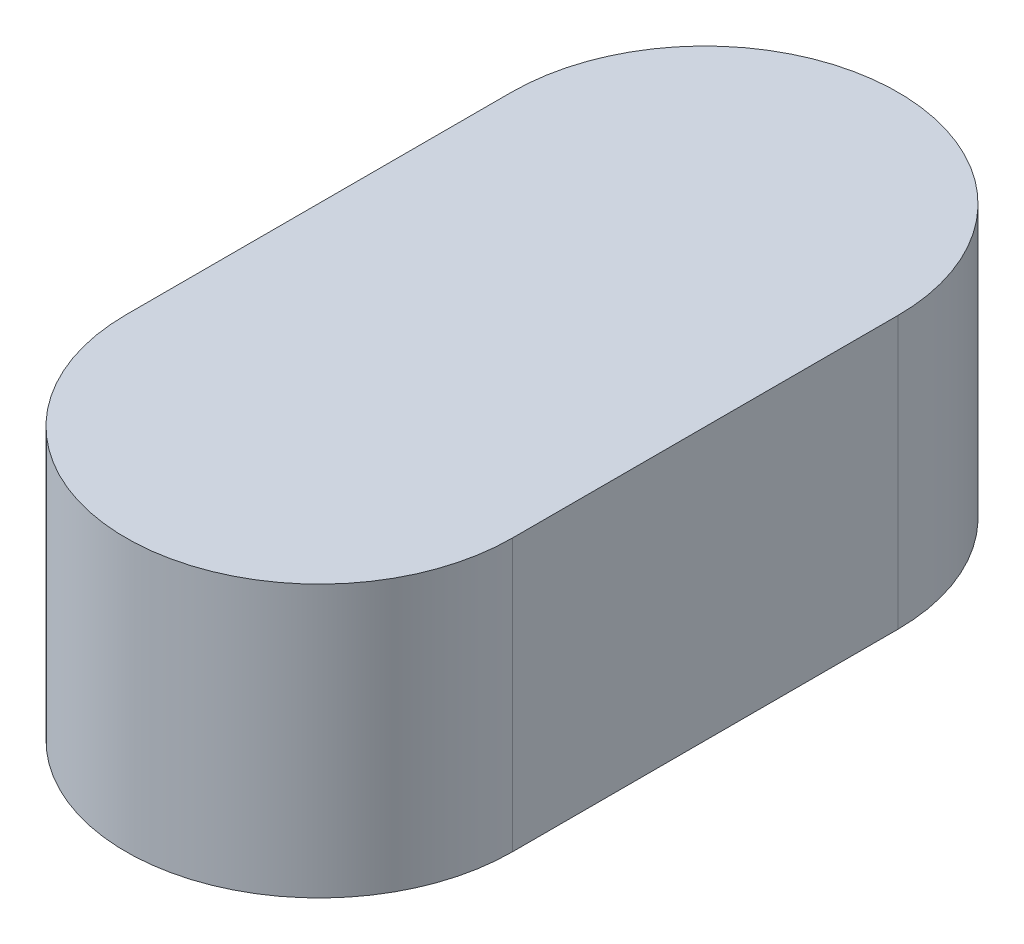
ISO-10303-21;
HEADER;
FILE_DESCRIPTION(('STEP AP214'),'2;1');
FILE_NAME('part.step','',(''),(''),'','','');
FILE_SCHEMA(('AUTOMOTIVE_DESIGN { 1 0 10303 214 1 1 1 1 }'));
ENDSEC;
DATA;
#1=APPLICATION_CONTEXT('core data for automotive mechanical design processes');
#2=APPLICATION_PROTOCOL_DEFINITION('international standard','automotive_design',2000,#1);
#3=PRODUCT_CONTEXT('',#1,'mechanical');
#4=PRODUCT('Part','Part','',(#3));
#5=PRODUCT_RELATED_PRODUCT_CATEGORY('part','',(#4));
#6=PRODUCT_DEFINITION_FORMATION('','',#4);
#7=PRODUCT_DEFINITION_CONTEXT('part definition',#1,'design');
#8=PRODUCT_DEFINITION('design','',#6,#7);
#9=PRODUCT_DEFINITION_SHAPE('','',#8);
#10=(LENGTH_UNIT() NAMED_UNIT(*) SI_UNIT(.MILLI.,.METRE.));
#11=(NAMED_UNIT(*) PLANE_ANGLE_UNIT() SI_UNIT($,.RADIAN.));
#12=(NAMED_UNIT(*) SI_UNIT($,.STERADIAN.) SOLID_ANGLE_UNIT());
#13=UNCERTAINTY_MEASURE_WITH_UNIT(LENGTH_MEASURE(1.E-05),#10,'distance_accuracy_value','');
#14=(GEOMETRIC_REPRESENTATION_CONTEXT(3) GLOBAL_UNCERTAINTY_ASSIGNED_CONTEXT((#13)) GLOBAL_UNIT_ASSIGNED_CONTEXT((#10,
#11,#12)) REPRESENTATION_CONTEXT('',''));
#15=CARTESIAN_POINT('',(0.,0.,0.));
#16=DIRECTION('',(0.,0.,1.));
#17=DIRECTION('',(1.,0.,0.));
#18=AXIS2_PLACEMENT_3D('',#15,#16,#17);
#19=CARTESIAN_POINT('',(523.369546430611,262.636,852.44114971681));
#20=DIRECTION('',(0.,-1.,0.));
#21=DIRECTION('',(0.,0.,-1.));
#22=AXIS2_PLACEMENT_3D('',#19,#20,#21);
#23=CYLINDRICAL_SURFACE('',#22,186.757711363559);
#24=CARTESIAN_POINT('',(523.369546430611,0.,852.44114971681));
#25=DIRECTION('',(0.,1.,0.));
#26=DIRECTION('',(0.,0.,1.));
#27=AXIS2_PLACEMENT_3D('',#24,#25,#26);
#28=CIRCLE('',#27,186.757711363559);
#29=CARTESIAN_POINT('',(710.12725779417,0.,852.44114971681));
#30=VERTEX_POINT('',#29);
#31=CARTESIAN_POINT('',(336.611835067052,0.,852.44114971681));
#32=VERTEX_POINT('',#31);
#33=EDGE_CURVE('E97',#30,#32,#28,.T.);
#34=ORIENTED_EDGE('',*,*,#33,.T.);
#35=DIRECTION('',(0.,-1.,0.));
#36=VECTOR('',#35,1.);
#37=CARTESIAN_POINT('',(336.611835067052,262.636,852.44114971681));
#38=LINE('',#37,#36);
#39=CARTESIAN_POINT('',(336.611835067052,262.636,852.44114971681));
#40=VERTEX_POINT('',#39);
#41=EDGE_CURVE('E11',#40,#32,#38,.T.);
#42=ORIENTED_EDGE('',*,*,#41,.F.);
#43=CARTESIAN_POINT('',(523.369546430611,262.636,852.44114971681));
#44=DIRECTION('',(0.,1.,0.));
#45=DIRECTION('',(0.,0.,1.));
#46=AXIS2_PLACEMENT_3D('',#43,#44,#45);
#47=CIRCLE('',#46,186.757711363559);
#48=CARTESIAN_POINT('',(710.12725779417,262.636,852.44114971681));
#49=VERTEX_POINT('',#48);
#50=EDGE_CURVE('E85',#49,#40,#47,.T.);
#51=ORIENTED_EDGE('',*,*,#50,.F.);
#52=DIRECTION('',(0.,-1.,0.));
#53=VECTOR('',#52,1.);
#54=CARTESIAN_POINT('',(710.12725779417,262.636,852.44114971681));
#55=LINE('',#54,#53);
#56=EDGE_CURVE('E93',#49,#30,#55,.T.);
#57=ORIENTED_EDGE('',*,*,#56,.T.);
#58=EDGE_LOOP('',(#34,#42,#51,#57));
#59=FACE_BOUND('',#58,.T.);
#60=ADVANCED_FACE('F34',(#59),#23,.T.);
#61=CARTESIAN_POINT('',(336.611835067052,262.636,852.44114971681));
#62=DIRECTION('',(1.,0.,0.));
#63=DIRECTION('',(0.,0.,-1.));
#64=AXIS2_PLACEMENT_3D('',#61,#62,#63);
#65=PLANE('',#64);
#66=DIRECTION('',(0.,0.,1.));
#67=VECTOR('',#66,1.);
#68=CARTESIAN_POINT('',(336.611835067052,0.,852.44114971681));
#69=LINE('',#68,#67);
#70=CARTESIAN_POINT('',(336.611835067052,0.,1224.89070806245));
#71=VERTEX_POINT('',#70);
#72=EDGE_CURVE('E89',#32,#71,#69,.T.);
#73=ORIENTED_EDGE('',*,*,#72,.T.);
#74=DIRECTION('',(0.,-1.,0.));
#75=VECTOR('',#74,1.);
#76=CARTESIAN_POINT('',(336.611835067052,262.636,1224.89070806245));
#77=LINE('',#76,#75);
#78=CARTESIAN_POINT('',(336.611835067052,262.636,1224.89070806245));
#79=VERTEX_POINT('',#78);
#80=EDGE_CURVE('E42',#79,#71,#77,.T.);
#81=ORIENTED_EDGE('',*,*,#80,.F.);
#82=DIRECTION('',(0.,0.,1.));
#83=VECTOR('',#82,1.);
#84=CARTESIAN_POINT('',(336.611835067052,262.636,852.44114971681));
#85=LINE('',#84,#83);
#86=EDGE_CURVE('E80',#40,#79,#85,.T.);
#87=ORIENTED_EDGE('',*,*,#86,.F.);
#88=ORIENTED_EDGE('',*,*,#41,.T.);
#89=EDGE_LOOP('',(#73,#81,#87,#88));
#90=FACE_BOUND('',#89,.T.);
#91=ADVANCED_FACE('F88',(#90),#65,.F.);
#92=CARTESIAN_POINT('',(523.369546430611,262.636,1224.89070806245));
#93=DIRECTION('',(0.,-1.,0.));
#94=DIRECTION('',(0.,0.,-1.));
#95=AXIS2_PLACEMENT_3D('',#92,#93,#94);
#96=CYLINDRICAL_SURFACE('',#95,186.757711363559);
#97=CARTESIAN_POINT('',(523.369546430611,0.,1224.89070806245));
#98=DIRECTION('',(0.,1.,0.));
#99=DIRECTION('',(0.,0.,1.));
#100=AXIS2_PLACEMENT_3D('',#97,#98,#99);
#101=CIRCLE('',#100,186.757711363559);
#102=CARTESIAN_POINT('',(710.12725779417,0.,1224.89070806245));
#103=VERTEX_POINT('',#102);
#104=EDGE_CURVE('E67',#71,#103,#101,.T.);
#105=ORIENTED_EDGE('',*,*,#104,.T.);
#106=DIRECTION('',(0.,-1.,0.));
#107=VECTOR('',#106,1.);
#108=CARTESIAN_POINT('',(710.12725779417,262.636,1224.89070806245));
#109=LINE('',#108,#107);
#110=CARTESIAN_POINT('',(710.12725779417,262.636,1224.89070806245));
#111=VERTEX_POINT('',#110);
#112=EDGE_CURVE('E90',#111,#103,#109,.T.);
#113=ORIENTED_EDGE('',*,*,#112,.F.);
#114=CARTESIAN_POINT('',(523.369546430611,262.636,1224.89070806245));
#115=DIRECTION('',(0.,1.,0.));
#116=DIRECTION('',(0.,0.,1.));
#117=AXIS2_PLACEMENT_3D('',#114,#115,#116);
#118=CIRCLE('',#117,186.757711363559);
#119=EDGE_CURVE('E83',#79,#111,#118,.T.);
#120=ORIENTED_EDGE('',*,*,#119,.F.);
#121=ORIENTED_EDGE('',*,*,#80,.T.);
#122=EDGE_LOOP('',(#105,#113,#120,#121));
#123=FACE_BOUND('',#122,.T.);
#124=ADVANCED_FACE('F91',(#123),#96,.T.);
#125=CARTESIAN_POINT('',(710.12725779417,262.636,852.44114971681));
#126=DIRECTION('',(-1.,0.,0.));
#127=DIRECTION('',(0.,0.,1.));
#128=AXIS2_PLACEMENT_3D('',#125,#126,#127);
#129=PLANE('',#128);
#130=DIRECTION('',(0.,0.,-1.));
#131=VECTOR('',#130,1.);
#132=CARTESIAN_POINT('',(710.12725779417,0.,852.44114971681));
#133=LINE('',#132,#131);
#134=EDGE_CURVE('E73',#103,#30,#133,.T.);
#135=ORIENTED_EDGE('',*,*,#134,.T.);
#136=ORIENTED_EDGE('',*,*,#56,.F.);
#137=DIRECTION('',(0.,0.,-1.));
#138=VECTOR('',#137,1.);
#139=CARTESIAN_POINT('',(710.12725779417,262.636,852.44114971681));
#140=LINE('',#139,#138);
#141=EDGE_CURVE('E50',#111,#49,#140,.T.);
#142=ORIENTED_EDGE('',*,*,#141,.F.);
#143=ORIENTED_EDGE('',*,*,#112,.T.);
#144=EDGE_LOOP('',(#135,#136,#142,#143));
#145=FACE_BOUND('',#144,.T.);
#146=ADVANCED_FACE('F104',(#145),#129,.F.);
#147=CARTESIAN_POINT('',(523.369546430611,262.636,852.44114971681));
#148=DIRECTION('',(0.,1.,0.));
#149=DIRECTION('',(0.,0.,1.));
#150=AXIS2_PLACEMENT_3D('',#147,#148,#149);
#151=PLANE('',#150);
#152=ORIENTED_EDGE('',*,*,#50,.T.);
#153=ORIENTED_EDGE('',*,*,#86,.T.);
#154=ORIENTED_EDGE('',*,*,#119,.T.);
#155=ORIENTED_EDGE('',*,*,#141,.T.);
#156=EDGE_LOOP('',(#152,#153,#154,#155));
#157=FACE_BOUND('',#156,.T.);
#158=ADVANCED_FACE('F81',(#157),#151,.T.);
#159=CARTESIAN_POINT('',(523.369546430611,0.,852.44114971681));
#160=DIRECTION('',(0.,1.,0.));
#161=DIRECTION('',(0.,0.,1.));
#162=AXIS2_PLACEMENT_3D('',#159,#160,#161);
#163=PLANE('',#162);
#164=ORIENTED_EDGE('',*,*,#33,.F.);
#165=ORIENTED_EDGE('',*,*,#134,.F.);
#166=ORIENTED_EDGE('',*,*,#104,.F.);
#167=ORIENTED_EDGE('',*,*,#72,.F.);
#168=EDGE_LOOP('',(#164,#165,#166,#167));
#169=FACE_BOUND('',#168,.T.);
#170=ADVANCED_FACE('F107',(#169),#163,.F.);
#171=CLOSED_SHELL('',(#60,#91,#124,#146,#158,#170));
#172=MANIFOLD_SOLID_BREP('B2',#171);
#173=ADVANCED_BREP_SHAPE_REPRESENTATION('',(#18,#172),#14);
#174=SHAPE_DEFINITION_REPRESENTATION(#9,#173);
ENDSEC;
END-ISO-10303-21;
